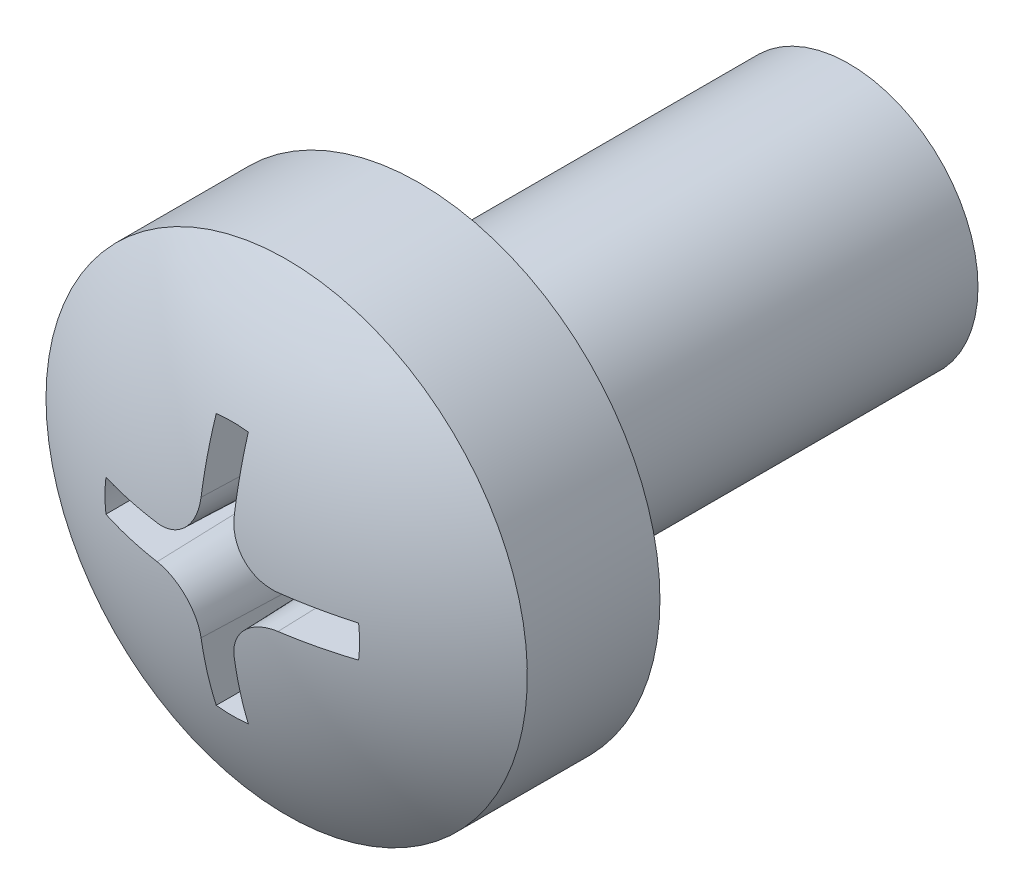
ISO-10303-21;
HEADER;
FILE_DESCRIPTION(('STEP AP214'),'2;1');
FILE_NAME('part.step','',(''),(''),'','','');
FILE_SCHEMA(('AUTOMOTIVE_DESIGN { 1 0 10303 214 1 1 1 1 }'));
ENDSEC;
DATA;
#1=APPLICATION_CONTEXT('core data for automotive mechanical design processes');
#2=APPLICATION_PROTOCOL_DEFINITION('international standard','automotive_design',2000,#1);
#3=PRODUCT_CONTEXT('',#1,'mechanical');
#4=PRODUCT('Part','Part','',(#3));
#5=PRODUCT_RELATED_PRODUCT_CATEGORY('part','',(#4));
#6=PRODUCT_DEFINITION_FORMATION('','',#4);
#7=PRODUCT_DEFINITION_CONTEXT('part definition',#1,'design');
#8=PRODUCT_DEFINITION('design','',#6,#7);
#9=PRODUCT_DEFINITION_SHAPE('','',#8);
#10=(LENGTH_UNIT() NAMED_UNIT(*) SI_UNIT(.MILLI.,.METRE.));
#11=(NAMED_UNIT(*) PLANE_ANGLE_UNIT() SI_UNIT($,.RADIAN.));
#12=(NAMED_UNIT(*) SI_UNIT($,.STERADIAN.) SOLID_ANGLE_UNIT());
#13=UNCERTAINTY_MEASURE_WITH_UNIT(LENGTH_MEASURE(1.E-05),#10,'distance_accuracy_value','');
#14=(GEOMETRIC_REPRESENTATION_CONTEXT(3) GLOBAL_UNCERTAINTY_ASSIGNED_CONTEXT((#13)) GLOBAL_UNIT_ASSIGNED_CONTEXT((#10,
#11,#12)) REPRESENTATION_CONTEXT('',''));
#15=CARTESIAN_POINT('',(0.,0.,0.));
#16=DIRECTION('',(0.,0.,1.));
#17=DIRECTION('',(1.,0.,0.));
#18=AXIS2_PLACEMENT_3D('',#15,#16,#17);
#19=CARTESIAN_POINT('',(0.,0.,5.));
#20=DIRECTION('',(0.,0.,-1.));
#21=DIRECTION('',(-1.,0.,0.));
#22=AXIS2_PLACEMENT_3D('',#19,#20,#21);
#23=CYLINDRICAL_SURFACE('',#22,1.5);
#24=CARTESIAN_POINT('',(0.,0.,5.));
#25=DIRECTION('',(0.,0.,1.));
#26=DIRECTION('',(1.,0.,0.));
#27=AXIS2_PLACEMENT_3D('',#24,#25,#26);
#28=CIRCLE('',#27,1.5);
#29=CARTESIAN_POINT('',(1.5,0.,5.));
#30=VERTEX_POINT('',#29);
#31=EDGE_CURVE('E213',#30,#30,#28,.T.);
#32=ORIENTED_EDGE('',*,*,#31,.F.);
#33=EDGE_LOOP('',(#32));
#34=FACE_BOUND('',#33,.T.);
#35=CARTESIAN_POINT('',(0.,0.,-0.0001));
#36=DIRECTION('',(0.,0.,1.));
#37=DIRECTION('',(1.,0.,0.));
#38=AXIS2_PLACEMENT_3D('',#35,#36,#37);
#39=CIRCLE('',#38,1.5);
#40=CARTESIAN_POINT('',(1.5,0.,-0.0001));
#41=VERTEX_POINT('',#40);
#42=EDGE_CURVE('E210',#41,#41,#39,.T.);
#43=ORIENTED_EDGE('',*,*,#42,.T.);
#44=EDGE_LOOP('',(#43));
#45=FACE_BOUND('',#44,.T.);
#46=ADVANCED_FACE('F39',(#34,#45),#23,.T.);
#47=CARTESIAN_POINT('',(0.,0.,-0.0001));
#48=DIRECTION('',(0.,0.,1.));
#49=DIRECTION('',(1.,0.,0.));
#50=AXIS2_PLACEMENT_3D('',#47,#48,#49);
#51=PLANE('',#50);
#52=ORIENTED_EDGE('',*,*,#42,.F.);
#53=EDGE_LOOP('',(#52));
#54=FACE_BOUND('',#53,.T.);
#55=ADVANCED_FACE('F300',(#54),#51,.F.);
#56=CARTESIAN_POINT('',(0.,0.,5.));
#57=DIRECTION('',(0.,0.,-1.));
#58=DIRECTION('',(-1.,0.,0.));
#59=AXIS2_PLACEMENT_3D('',#56,#57,#58);
#60=PLANE('',#59);
#61=ORIENTED_EDGE('',*,*,#31,.T.);
#62=EDGE_LOOP('',(#61));
#63=FACE_BOUND('',#62,.T.);
#64=CARTESIAN_POINT('',(0.,0.,5.));
#65=DIRECTION('',(0.,0.,-1.));
#66=DIRECTION('',(-1.,0.,0.));
#67=AXIS2_PLACEMENT_3D('',#64,#65,#66);
#68=CIRCLE('',#67,2.79999990016222);
#69=CARTESIAN_POINT('',(-2.79999990016222,0.,5.));
#70=VERTEX_POINT('',#69);
#71=EDGE_CURVE('E207',#70,#70,#68,.T.);
#72=ORIENTED_EDGE('',*,*,#71,.T.);
#73=EDGE_LOOP('',(#72));
#74=FACE_BOUND('',#73,.T.);
#75=ADVANCED_FACE('F305',(#63,#74),#60,.T.);
#76=CARTESIAN_POINT('',(0.,0.,-0.393620134621003));
#77=DIRECTION('',(0.,0.,-1.));
#78=DIRECTION('',(-1.,0.,0.));
#79=AXIS2_PLACEMENT_3D('',#76,#77,#78);
#80=CYLINDRICAL_SURFACE('',#79,2.79999990016222);
#81=CARTESIAN_POINT('',(0.,0.,6.54246307978926));
#82=DIRECTION('',(0.,0.,-1.));
#83=DIRECTION('',(-1.,0.,0.));
#84=AXIS2_PLACEMENT_3D('',#81,#82,#83);
#85=CIRCLE('',#84,2.79999990016222);
#86=CARTESIAN_POINT('',(-2.79999990016222,0.,6.54246307978926));
#87=VERTEX_POINT('',#86);
#88=EDGE_CURVE('E155',#87,#87,#85,.T.);
#89=ORIENTED_EDGE('',*,*,#88,.T.);
#90=EDGE_LOOP('',(#89));
#91=FACE_BOUND('',#90,.T.);
#92=ORIENTED_EDGE('',*,*,#71,.F.);
#93=EDGE_LOOP('',(#92));
#94=FACE_BOUND('',#93,.T.);
#95=ADVANCED_FACE('F313',(#91,#94),#80,.T.);
#96=CARTESIAN_POINT('',(0.,0.,2.40000011175871));
#97=DIRECTION('',(0.,0.,-1.));
#98=DIRECTION('',(1.,0.,0.));
#99=AXIS2_PLACEMENT_3D('',#96,#97,#98);
#100=SPHERICAL_SURFACE('',#99,4.99999988824129);
#101=CARTESIAN_POINT('',(0.,0.,7.17541838215017));
#102=DIRECTION('',(0.,0.,-1.));
#103=DIRECTION('',(-1.,0.,0.));
#104=AXIS2_PLACEMENT_3D('',#101,#102,#103);
#105=CIRCLE('',#104,1.4816812157899);
#106=CARTESIAN_POINT('',(0.18668120666759,1.46987392394782,7.17541838215014));
#107=VERTEX_POINT('',#106);
#108=CARTESIAN_POINT('',(-0.186681206667593,1.46987392394782,7.17541838215014));
#109=VERTEX_POINT('',#108);
#110=EDGE_CURVE('E11',#107,#109,#105,.F.);
#111=ORIENTED_EDGE('',*,*,#110,.F.);
#112=CARTESIAN_POINT('',(0.0198956640512633,0.,2.39930533986049));
#113=DIRECTION('',(0.999390827019096,0.,-0.034899496702501));
#114=DIRECTION('',(-0.034899496702501,0.,-0.999390827019096));
#115=AXIS2_PLACEMENT_3D('',#112,#113,#114);
#116=CIRCLE('',#115,4.99996025606773);
#117=CARTESIAN_POINT('',(0.192632610704328,0.708178557647151,7.34584429553512));
#118=VERTEX_POINT('',#117);
#119=EDGE_CURVE('E46',#107,#118,#116,.T.);
#120=ORIENTED_EDGE('',*,*,#119,.T.);
#121=CARTESIAN_POINT('',(0.192631650862954,0.708378557647151,7.34581569147501));
#122=CARTESIAN_POINT('',(0.192737639690806,0.679822741796073,7.34990414397343));
#123=CARTESIAN_POINT('',(0.195268867839181,0.651227392830895,7.35364633624145));
#124=CARTESIAN_POINT('',(0.205046889209158,0.594767038274589,7.36034605517117));
#125=CARTESIAN_POINT('',(0.212292618678018,0.566901869404939,7.36330375862852));
#126=CARTESIAN_POINT('',(0.231373694375068,0.51267267841366,7.36834660632538));
#127=CARTESIAN_POINT('',(0.24321326807329,0.486310064716558,7.37043094316672));
#128=CARTESIAN_POINT('',(0.271156607880554,0.435900324544808,7.37366034910124));
#129=CARTESIAN_POINT('',(0.287258672100205,0.411852279143785,7.37480579232145));
#130=CARTESIAN_POINT('',(0.323072075489886,0.367028886470805,7.37611580257173));
#131=CARTESIAN_POINT('',(0.342740648168188,0.346219679514825,7.37629128935958));
#132=CARTESIAN_POINT('',(0.385246757538768,0.308146709447779,7.37568534569509));
#133=CARTESIAN_POINT('',(0.408084792807392,0.290883505206881,7.37490376453834));
#134=CARTESIAN_POINT('',(0.456147210008962,0.260464262414973,7.37241339517053));
#135=CARTESIAN_POINT('',(0.481359759209806,0.247289131136678,7.37070902247329));
#136=CARTESIAN_POINT('',(0.533541444049374,0.225283958921734,7.3664258870809));
#137=CARTESIAN_POINT('',(0.560509920861878,0.216452298826715,7.36384745082543));
#138=CARTESIAN_POINT('',(0.606876295057339,0.205379627868596,7.35882076515576));
#139=CARTESIAN_POINT('',(0.626020977094075,0.201943221890058,7.35658129607485));
#140=CARTESIAN_POINT('',(0.664502044043211,0.197253494550335,7.3517582366185));
#141=CARTESIAN_POINT('',(0.683838077649067,0.195996727127303,7.34917519641301));
#142=CARTESIAN_POINT('',(0.703167546290468,0.195835015722445,7.34643346629547));
#143=B_SPLINE_CURVE_WITH_KNOTS('',3,(#121,#122,#123,#124,#125,#126,#127,#128,#129,#130,#131,
#132,#133,#134,#135,#136,#137,#138,#139,#140,#141,#142),.UNSPECIFIED.,.F.,.F.,(4,2,2,2,2,2,2,2,
2,2,4),(0.,0.0864417829586748,0.172864068455127,0.259366073122685,0.345833591994609,
0.43132564691208,0.516831165542017,0.601931114274005,0.686999315371811,0.745618262708562,
0.804144447281415),.UNSPECIFIED.);
#144=CARTESIAN_POINT('',(0.702917362553185,0.19583721033533,7.3464689381926));
#145=VERTEX_POINT('',#144);
#146=EDGE_CURVE('E282',#118,#145,#143,.T.);
#147=ORIENTED_EDGE('',*,*,#146,.T.);
#148=CARTESIAN_POINT('',(0.00010539015335045,0.0259265633149155,2.39909472873738));
#149=DIRECTION('',(0.00406243901494415,0.999382570249833,-0.034899496702501));
#150=DIRECTION('',(0.,0.0348997846864301,0.999390816962434));
#151=AXIS2_PLACEMENT_3D('',#148,#149,#150);
#152=CIRCLE('',#151,4.99993258603575);
#153=CARTESIAN_POINT('',(1.46986565043204,0.186746338396853,7.17541838215017));
#154=VERTEX_POINT('',#153);
#155=EDGE_CURVE('E280',#154,#145,#152,.F.);
#156=ORIENTED_EDGE('',*,*,#155,.F.);
#157=CARTESIAN_POINT('',(0.,0.,7.17541838215017));
#158=DIRECTION('',(0.,0.,-1.));
#159=DIRECTION('',(-1.,0.,0.));
#160=AXIS2_PLACEMENT_3D('',#157,#158,#159);
#161=CIRCLE('',#160,1.4816812157899);
#162=CARTESIAN_POINT('',(1.46986565043204,-0.186746338396852,7.17541838215014));
#163=VERTEX_POINT('',#162);
#164=EDGE_CURVE('E278',#163,#154,#161,.F.);
#165=ORIENTED_EDGE('',*,*,#164,.F.);
#166=CARTESIAN_POINT('',(0.000105390153350481,-0.0259265633149169,2.39909472873738));
#167=DIRECTION('',(0.00406243901494512,-0.999382570249833,-0.034899496702501));
#168=DIRECTION('',(0.,0.0348997846864301,-0.999390816962434));
#169=AXIS2_PLACEMENT_3D('',#166,#167,#168);
#170=CIRCLE('',#169,4.99993258603575);
#171=CARTESIAN_POINT('',(0.702917362553185,-0.195837210335331,7.3464689381926));
#172=VERTEX_POINT('',#171);
#173=EDGE_CURVE('E275',#163,#172,#170,.T.);
#174=ORIENTED_EDGE('',*,*,#173,.T.);
#175=CARTESIAN_POINT('',(0.192631650862954,-0.708378557647152,7.34581569147501));
#176=CARTESIAN_POINT('',(0.192737639690806,-0.679822741796074,7.34990414397343));
#177=CARTESIAN_POINT('',(0.195268867839181,-0.651227392830896,7.35364633624145));
#178=CARTESIAN_POINT('',(0.205046889209158,-0.59476703827459,7.36034605517117));
#179=CARTESIAN_POINT('',(0.212292618678018,-0.566901869404939,7.36330375862852));
#180=CARTESIAN_POINT('',(0.231373694375068,-0.51267267841366,7.36834660632538));
#181=CARTESIAN_POINT('',(0.24321326807329,-0.486310064716559,7.37043094316673));
#182=CARTESIAN_POINT('',(0.271156607880554,-0.435900324544809,7.37366034910124));
#183=CARTESIAN_POINT('',(0.287258672100205,-0.411852279143786,7.37480579232145));
#184=CARTESIAN_POINT('',(0.323072075489886,-0.367028886470806,7.37611580257173));
#185=CARTESIAN_POINT('',(0.342740648168188,-0.346219679514826,7.37629128935958));
#186=CARTESIAN_POINT('',(0.385246757538768,-0.30814670944778,7.37568534569509));
#187=CARTESIAN_POINT('',(0.408084792807393,-0.290883505206882,7.37490376453834));
#188=CARTESIAN_POINT('',(0.456147210008962,-0.260464262414974,7.37241339517053));
#189=CARTESIAN_POINT('',(0.481359759209806,-0.247289131136679,7.37070902247329));
#190=CARTESIAN_POINT('',(0.533541444049375,-0.225283958921735,7.3664258870809));
#191=CARTESIAN_POINT('',(0.560509920861878,-0.216452298826716,7.36384745082543));
#192=CARTESIAN_POINT('',(0.606876295057339,-0.205379627868597,7.35882076515576));
#193=CARTESIAN_POINT('',(0.626020977094075,-0.201943221890059,7.35658129607485));
#194=CARTESIAN_POINT('',(0.664502044043211,-0.197253494550336,7.3517582366185));
#195=CARTESIAN_POINT('',(0.683838077649067,-0.195996727127304,7.34917519641301));
#196=CARTESIAN_POINT('',(0.703167546290467,-0.195835015722445,7.34643346629547));
#197=B_SPLINE_CURVE_WITH_KNOTS('',3,(#175,#176,#177,#178,#179,#180,#181,#182,#183,#184,#185,
#186,#187,#188,#189,#190,#191,#192,#193,#194,#195,#196),.UNSPECIFIED.,.F.,.F.,(4,2,2,2,2,2,2,2,
2,2,4),(0.,0.086441782958675,0.172864068455127,0.259366073122685,0.345833591994609,
0.43132564691208,0.516831165542017,0.601931114274005,0.686999315371811,0.745618262708562,
0.804144447281415),.UNSPECIFIED.);
#198=CARTESIAN_POINT('',(0.192632610704328,-0.708178557647152,7.34584429553512));
#199=VERTEX_POINT('',#198);
#200=EDGE_CURVE('E269',#199,#172,#197,.T.);
#201=ORIENTED_EDGE('',*,*,#200,.F.);
#202=CARTESIAN_POINT('',(0.0198956640512633,0.,2.39930533986049));
#203=DIRECTION('',(0.999390827019096,0.,-0.034899496702501));
#204=DIRECTION('',(-0.034899496702501,0.,-0.999390827019096));
#205=AXIS2_PLACEMENT_3D('',#202,#203,#204);
#206=CIRCLE('',#205,4.99996025606773);
#207=CARTESIAN_POINT('',(0.186681206667591,-1.46987392394782,7.17541838215017));
#208=VERTEX_POINT('',#207);
#209=EDGE_CURVE('E267',#208,#199,#206,.F.);
#210=ORIENTED_EDGE('',*,*,#209,.F.);
#211=CARTESIAN_POINT('',(0.,0.,7.17541838215017));
#212=DIRECTION('',(0.,0.,-1.));
#213=DIRECTION('',(-1.,0.,0.));
#214=AXIS2_PLACEMENT_3D('',#211,#212,#213);
#215=CIRCLE('',#214,1.4816812157899);
#216=CARTESIAN_POINT('',(-0.186681206667593,-1.46987392394782,7.17541838215014));
#217=VERTEX_POINT('',#216);
#218=EDGE_CURVE('E264',#208,#217,#215,.T.);
#219=ORIENTED_EDGE('',*,*,#218,.T.);
#220=CARTESIAN_POINT('',(-0.0198956640512654,0.,2.39930533986049));
#221=DIRECTION('',(-0.999390827019096,0.,-0.034899496702501));
#222=DIRECTION('',(-0.034899496702501,0.,0.999390827019096));
#223=AXIS2_PLACEMENT_3D('',#220,#221,#222);
#224=CIRCLE('',#223,4.99996025606773);
#225=CARTESIAN_POINT('',(-0.19263261070433,-0.708178557647151,7.34584429553512));
#226=VERTEX_POINT('',#225);
#227=EDGE_CURVE('E260',#217,#226,#224,.T.);
#228=ORIENTED_EDGE('',*,*,#227,.T.);
#229=CARTESIAN_POINT('',(-0.703167546290469,-0.195835015722445,7.34643346629547));
#230=CARTESIAN_POINT('',(-0.674619447950853,-0.196052963217916,7.35048572416475));
#231=CARTESIAN_POINT('',(-0.646041434637229,-0.198695168407334,7.35418904161906));
#232=CARTESIAN_POINT('',(-0.589634494727846,-0.208689654905481,7.36080680147558));
#233=CARTESIAN_POINT('',(-0.561805393198952,-0.216040826152063,7.36372142956822));
#234=CARTESIAN_POINT('',(-0.50766612082123,-0.235323893103952,7.36867508610456));
#235=CARTESIAN_POINT('',(-0.481357369172764,-0.247259991703852,7.37071330752301));
#236=CARTESIAN_POINT('',(-0.431071022991569,-0.275383990623327,7.37384890996341));
#237=CARTESIAN_POINT('',(-0.407092510169895,-0.291570206692358,7.37494666294437));
#238=CARTESIAN_POINT('',(-0.362416703115867,-0.327538701485094,7.37616180832018));
#239=CARTESIAN_POINT('',(-0.34168588735275,-0.347278991317759,7.37628996638402));
#240=CARTESIAN_POINT('',(-0.303780328011577,-0.389912448398922,7.37559036471605));
#241=CARTESIAN_POINT('',(-0.286606147147997,-0.412806113607388,7.37476245385545));
#242=CARTESIAN_POINT('',(-0.25636685808405,-0.460969475916929,7.37218162580557));
#243=CARTESIAN_POINT('',(-0.243283863198687,-0.486228184526672,7.37043282748058));
#244=CARTESIAN_POINT('',(-0.22146899790456,-0.538485231439468,7.36606389829698));
#245=CARTESIAN_POINT('',(-0.212735526227358,-0.565482925398505,7.36344408869266));
#246=CARTESIAN_POINT('',(-0.201823996880683,-0.61191361527353,7.35834781298739));
#247=CARTESIAN_POINT('',(-0.198453223120025,-0.631098599357625,7.3560784464194));
#248=CARTESIAN_POINT('',(-0.193901764340931,-0.669652448873598,7.35119687303864));
#249=CARTESIAN_POINT('',(-0.192717622166764,-0.689020975292663,7.34858521441869));
#250=CARTESIAN_POINT('',(-0.192631650862956,-0.708378557647151,7.34581569147501));
#251=B_SPLINE_CURVE_WITH_KNOTS('',3,(#229,#230,#231,#232,#233,#234,#235,#236,#237,#238,#239,
#240,#241,#242,#243,#244,#245,#246,#247,#248,#249,#250),.UNSPECIFIED.,.F.,.F.,(4,2,2,2,2,2,2,2,
2,2,4),(0.,0.0864053436114192,0.172790326060609,0.259254685287909,0.34568483171133,
0.431153892876567,0.51663646625136,0.601739908197796,0.686811996276178,0.745524819849982,
0.804144736260156),.UNSPECIFIED.);
#252=CARTESIAN_POINT('',(-0.702917362553187,-0.195837210335331,7.3464689381926));
#253=VERTEX_POINT('',#252);
#254=EDGE_CURVE('E253',#253,#226,#251,.T.);
#255=ORIENTED_EDGE('',*,*,#254,.F.);
#256=CARTESIAN_POINT('',(-0.000105390153349556,-0.0259265633149168,2.39909472873738));
#257=DIRECTION('',(-0.0040624390149453,-0.999382570249833,-0.034899496702501));
#258=DIRECTION('',(0.,0.0348997846864301,-0.999390816962434));
#259=AXIS2_PLACEMENT_3D('',#256,#257,#258);
#260=CIRCLE('',#259,4.99993258603575);
#261=CARTESIAN_POINT('',(-1.46986565043204,-0.186746338396853,7.17541838215018));
#262=VERTEX_POINT('',#261);
#263=EDGE_CURVE('E261',#262,#253,#260,.F.);
#264=ORIENTED_EDGE('',*,*,#263,.F.);
#265=CARTESIAN_POINT('',(0.,0.,7.17541838215018));
#266=DIRECTION('',(0.,0.,-1.));
#267=DIRECTION('',(-1.,0.,0.));
#268=AXIS2_PLACEMENT_3D('',#265,#266,#267);
#269=CIRCLE('',#268,1.4816812157899);
#270=CARTESIAN_POINT('',(-1.46986565043204,0.186746338396852,7.17541838215014));
#271=VERTEX_POINT('',#270);
#272=EDGE_CURVE('E521',#262,#271,#269,.T.);
#273=ORIENTED_EDGE('',*,*,#272,.T.);
#274=CARTESIAN_POINT('',(-0.000105390153349556,0.0259265633149168,2.39909472873738));
#275=DIRECTION('',(-0.00406243901494529,0.999382570249833,-0.034899496702501));
#276=DIRECTION('',(0.,0.0348997846864301,0.999390816962434));
#277=AXIS2_PLACEMENT_3D('',#274,#275,#276);
#278=CIRCLE('',#277,4.99993258603575);
#279=CARTESIAN_POINT('',(-0.702917362553187,0.195837210335331,7.3464689381926));
#280=VERTEX_POINT('',#279);
#281=EDGE_CURVE('E226',#271,#280,#278,.T.);
#282=ORIENTED_EDGE('',*,*,#281,.T.);
#283=CARTESIAN_POINT('',(-0.192631650862955,0.708378557647151,7.34581569147501));
#284=CARTESIAN_POINT('',(-0.192737639690808,0.679822741796074,7.34990414397343));
#285=CARTESIAN_POINT('',(-0.195268867839183,0.651227392830896,7.35364633624145));
#286=CARTESIAN_POINT('',(-0.20504688920916,0.59476703827459,7.36034605517117));
#287=CARTESIAN_POINT('',(-0.21229261867802,0.566901869404939,7.36330375862852));
#288=CARTESIAN_POINT('',(-0.23137369437507,0.51267267841366,7.36834660632538));
#289=CARTESIAN_POINT('',(-0.243213268073292,0.486310064716558,7.37043094316673));
#290=CARTESIAN_POINT('',(-0.271156607880556,0.435900324544809,7.37366034910124));
#291=CARTESIAN_POINT('',(-0.287258672100207,0.411852279143786,7.37480579232145));
#292=CARTESIAN_POINT('',(-0.323072075489888,0.367028886470806,7.37611580257173));
#293=CARTESIAN_POINT('',(-0.34274064816819,0.346219679514825,7.37629128935958));
#294=CARTESIAN_POINT('',(-0.38524675753877,0.30814670944778,7.37568534569509));
#295=CARTESIAN_POINT('',(-0.408084792807394,0.290883505206881,7.37490376453834));
#296=CARTESIAN_POINT('',(-0.456147210008964,0.260464262414973,7.37241339517053));
#297=CARTESIAN_POINT('',(-0.481359759209807,0.247289131136679,7.37070902247329));
#298=CARTESIAN_POINT('',(-0.533541444049376,0.225283958921734,7.3664258870809));
#299=CARTESIAN_POINT('',(-0.56050992086188,0.216452298826716,7.36384745082543));
#300=CARTESIAN_POINT('',(-0.606876295057341,0.205379627868597,7.35882076515576));
#301=CARTESIAN_POINT('',(-0.626020977094076,0.201943221890059,7.35658129607485));
#302=CARTESIAN_POINT('',(-0.664502044043212,0.197253494550336,7.3517582366185));
#303=CARTESIAN_POINT('',(-0.683838077649069,0.195996727127304,7.34917519641301));
#304=CARTESIAN_POINT('',(-0.703167546290469,0.195835015722445,7.34643346629547));
#305=B_SPLINE_CURVE_WITH_KNOTS('',3,(#283,#284,#285,#286,#287,#288,#289,#290,#291,#292,#293,
#294,#295,#296,#297,#298,#299,#300,#301,#302,#303,#304),.UNSPECIFIED.,.F.,.F.,(4,2,2,2,2,2,2,2,
2,2,4),(0.,0.0864417829586746,0.172864068455127,0.259366073122685,0.345833591994609,
0.431325646912079,0.516831165542017,0.601931114274005,0.686999315371811,0.745618262708562,
0.804144447281414),.UNSPECIFIED.);
#306=CARTESIAN_POINT('',(-0.19263261070433,0.708178557647151,7.34584429553512));
#307=VERTEX_POINT('',#306);
#308=EDGE_CURVE('E218',#307,#280,#305,.T.);
#309=ORIENTED_EDGE('',*,*,#308,.F.);
#310=CARTESIAN_POINT('',(-0.0198956640512644,0.,2.39930533986049));
#311=DIRECTION('',(-0.999390827019096,0.,-0.034899496702501));
#312=DIRECTION('',(-0.034899496702501,0.,0.999390827019096));
#313=AXIS2_PLACEMENT_3D('',#310,#311,#312);
#314=CIRCLE('',#313,4.99996025606773);
#315=EDGE_CURVE('E216',#109,#307,#314,.F.);
#316=ORIENTED_EDGE('',*,*,#315,.F.);
#317=EDGE_LOOP('',(#111,#120,#147,#156,#165,#174,#201,#210,#219,#228,#255,#264,#273,#282,#309,#316));
#318=FACE_BOUND('',#317,.T.);
#319=ORIENTED_EDGE('',*,*,#88,.F.);
#320=EDGE_LOOP('',(#319));
#321=FACE_BOUND('',#320,.T.);
#322=ADVANCED_FACE('F228',(#318,#321),#100,.T.);
#323=CARTESIAN_POINT('',(0.,0.,7.7000001));
#324=DIRECTION('',(0.,0.,1.));
#325=DIRECTION('',(1.,0.,0.));
#326=AXIS2_PLACEMENT_3D('',#323,#324,#325);
#327=CONICAL_SURFACE('',#326,1.50000001303852,0.0349065850398867);
#328=ORIENTED_EDGE('',*,*,#110,.T.);
#329=CARTESIAN_POINT('',(-0.142142619910814,1.43009594495933,5.90000013091991));
#330=CARTESIAN_POINT('',(-0.152618658076336,1.43957885994155,6.19999461322929));
#331=CARTESIAN_POINT('',(-0.163094792502732,1.4489727928664,6.49999185208944));
#332=CARTESIAN_POINT('',(-0.184047253837866,1.46758269456637,7.09999184178283));
#333=CARTESIAN_POINT('',(-0.194523580746602,1.47679866334215,7.39999459261603));
#334=CARTESIAN_POINT('',(-0.205000003916213,1.48592565006124,7.7000001));
#335=B_SPLINE_CURVE_WITH_KNOTS('',3,(#329,#330,#331,#332,#333,#334),.UNSPECIFIED.,.F.,.F.,(4,2,
4),(0.,0.900981158642232,1.80196231389533),.UNSPECIFIED.);
#336=CARTESIAN_POINT('',(-0.142142619910814,1.43009594495933,5.90000013091991));
#337=VERTEX_POINT('',#336);
#338=EDGE_CURVE('E53',#337,#109,#335,.T.);
#339=ORIENTED_EDGE('',*,*,#338,.F.);
#340=CARTESIAN_POINT('',(0.,0.,5.90000013091991));
#341=DIRECTION('',(0.,0.,1.));
#342=DIRECTION('',(1.,0.,0.));
#343=AXIS2_PLACEMENT_3D('',#340,#341,#342);
#344=CIRCLE('',#343,1.43714262903312);
#345=CARTESIAN_POINT('',(0.142142619910811,1.43009594495933,5.90000013091991));
#346=VERTEX_POINT('',#345);
#347=EDGE_CURVE('E163',#346,#337,#344,.T.);
#348=ORIENTED_EDGE('',*,*,#347,.F.);
#349=CARTESIAN_POINT('',(0.142142619910811,1.43009594495933,5.90000013091991));
#350=CARTESIAN_POINT('',(0.152618658076333,1.43957885994155,6.19999461322929));
#351=CARTESIAN_POINT('',(0.16309479250273,1.4489727928664,6.49999185208944));
#352=CARTESIAN_POINT('',(0.184047253837863,1.46758269456637,7.09999184178283));
#353=CARTESIAN_POINT('',(0.1945235807466,1.47679866334215,7.39999459261603));
#354=CARTESIAN_POINT('',(0.205000003916211,1.48592565006124,7.7000001));
#355=B_SPLINE_CURVE_WITH_KNOTS('',3,(#349,#350,#351,#352,#353,#354),.UNSPECIFIED.,.F.,.F.,(4,2,
4),(0.,0.900981158642232,1.80196231389533),.UNSPECIFIED.);
#356=EDGE_CURVE('E147',#346,#107,#355,.T.);
#357=ORIENTED_EDGE('',*,*,#356,.T.);
#358=EDGE_LOOP('',(#328,#339,#348,#357));
#359=FACE_BOUND('',#358,.T.);
#360=ADVANCED_FACE('F167',(#359),#327,.F.);
#361=CARTESIAN_POINT('',(0.205000003916211,1.48592565006124,7.7000001));
#362=DIRECTION('',(0.999390827019096,0.,-0.034899496702501));
#363=DIRECTION('',(-0.034899496702501,0.,-0.999390827019096));
#364=AXIS2_PLACEMENT_3D('',#361,#362,#363);
#365=PLANE('',#364);
#366=ORIENTED_EDGE('',*,*,#356,.F.);
#367=DIRECTION('',(0.,1.,0.));
#368=VECTOR('',#367,1.);
#369=CARTESIAN_POINT('',(0.142142619910812,0.,5.90000013091991));
#370=LINE('',#369,#368);
#371=CARTESIAN_POINT('',(0.142142619910811,0.708178557647151,5.90000013091991));
#372=VERTEX_POINT('',#371);
#373=EDGE_CURVE('E150',#346,#372,#370,.F.);
#374=ORIENTED_EDGE('',*,*,#373,.T.);
#375=DIRECTION('',(0.034899496702501,0.,0.999390827019096));
#376=VECTOR('',#375,1.);
#377=CARTESIAN_POINT('',(0.20500000391621,0.708178557647151,7.7000001));
#378=LINE('',#377,#376);
#379=EDGE_CURVE('E156',#372,#118,#378,.T.);
#380=ORIENTED_EDGE('',*,*,#379,.T.);
#381=ORIENTED_EDGE('',*,*,#119,.F.);
#382=EDGE_LOOP('',(#366,#374,#380,#381));
#383=FACE_BOUND('',#382,.T.);
#384=ADVANCED_FACE('F149',(#383),#365,.F.);
#385=CARTESIAN_POINT('',(0.705000003916211,0.708178557647151,7.7000001));
#386=DIRECTION('',(0.,0.,-1.));
#387=DIRECTION('',(1.,0.,0.));
#388=AXIS2_PLACEMENT_3D('',#385,#386,#387);
#389=CONICAL_SURFACE('',#388,0.5,0.0349065850398867);
#390=ORIENTED_EDGE('',*,*,#379,.F.);
#391=CARTESIAN_POINT('',(0.705000003916211,0.708178557647151,5.90000013091991));
#392=DIRECTION('',(0.,0.,1.));
#393=DIRECTION('',(1.,0.,0.));
#394=AXIS2_PLACEMENT_3D('',#391,#392,#393);
#395=CIRCLE('',#394,0.562857384005399);
#396=CARTESIAN_POINT('',(0.702712036351556,0.145325823858085,5.90000013091991));
#397=VERTEX_POINT('',#396);
#398=EDGE_CURVE('E165',#372,#397,#395,.T.);
#399=ORIENTED_EDGE('',*,*,#398,.T.);
#400=DIRECTION('',(0.000141863496415148,0.0348992083697649,0.999390827019096));
#401=VECTOR('',#400,1.);
#402=CARTESIAN_POINT('',(0.702967546290468,0.208182688548215,7.7000001));
#403=LINE('',#402,#401);
#404=EDGE_CURVE('E423',#397,#145,#403,.T.);
#405=ORIENTED_EDGE('',*,*,#404,.T.);
#406=ORIENTED_EDGE('',*,*,#146,.F.);
#407=EDGE_LOOP('',(#390,#399,#405,#406));
#408=FACE_BOUND('',#407,.T.);
#409=ADVANCED_FACE('F288',(#408),#389,.T.);
#410=CARTESIAN_POINT('',(1.48592565006123,0.205000003916213,7.7000001));
#411=DIRECTION('',(0.00406243901494415,0.999382570249833,-0.034899496702501));
#412=DIRECTION('',(0.,0.0348997846864301,0.999390816962434));
#413=AXIS2_PLACEMENT_3D('',#410,#411,#412);
#414=PLANE('',#413);
#415=ORIENTED_EDGE('',*,*,#155,.T.);
#416=ORIENTED_EDGE('',*,*,#404,.F.);
#417=DIRECTION('',(-0.99999173819787,0.00406491525148502,0.));
#418=VECTOR('',#417,1.);
#419=CARTESIAN_POINT('',(0.000602343564913371,0.148179863836023,5.90000013091991));
#420=LINE('',#419,#418);
#421=CARTESIAN_POINT('',(1.43007341244828,0.142369137079488,5.90000013091991));
#422=VERTEX_POINT('',#421);
#423=EDGE_CURVE('E176',#422,#397,#420,.T.);
#424=ORIENTED_EDGE('',*,*,#423,.F.);
#425=CARTESIAN_POINT('',(1.43007341244828,0.142369137079488,5.90000013091991));
#426=CARTESIAN_POINT('',(1.43955869120937,0.152806706922151,6.19999467904414));
#427=CARTESIAN_POINT('',(1.44895568373278,0.163244730756208,6.49999195080733));
#428=CARTESIAN_POINT('',(1.46757309626977,0.184121686368453,7.09999194050071));
#429=CARTESIAN_POINT('',(1.47679351628402,0.194560618146638,7.39999465843089));
#430=CARTESIAN_POINT('',(1.48592565006123,0.205000003916213,7.7000001));
#431=B_SPLINE_CURVE_WITH_KNOTS('',3,(#425,#426,#427,#428,#429,#430),.UNSPECIFIED.,.F.,.F.,(4,2,
4),(0.,0.900977563471275,1.80195512360615),.UNSPECIFIED.);
#432=EDGE_CURVE('E417',#422,#154,#431,.T.);
#433=ORIENTED_EDGE('',*,*,#432,.T.);
#434=EDGE_LOOP('',(#415,#416,#424,#433));
#435=FACE_BOUND('',#434,.T.);
#436=ADVANCED_FACE('F240',(#435),#414,.F.);
#437=CARTESIAN_POINT('',(0.,0.,7.7000001));
#438=DIRECTION('',(0.,0.,1.));
#439=DIRECTION('',(1.,0.,0.));
#440=AXIS2_PLACEMENT_3D('',#437,#438,#439);
#441=CONICAL_SURFACE('',#440,1.50000001303852,0.0349065850398867);
#442=ORIENTED_EDGE('',*,*,#164,.T.);
#443=ORIENTED_EDGE('',*,*,#432,.F.);
#444=CARTESIAN_POINT('',(0.,0.,5.90000013091991));
#445=DIRECTION('',(0.,0.,1.));
#446=DIRECTION('',(1.,0.,0.));
#447=AXIS2_PLACEMENT_3D('',#444,#445,#446);
#448=CIRCLE('',#447,1.43714262903312);
#449=CARTESIAN_POINT('',(1.43007341244828,-0.142369137079488,5.90000013091991));
#450=VERTEX_POINT('',#449);
#451=EDGE_CURVE('E178',#450,#422,#448,.T.);
#452=ORIENTED_EDGE('',*,*,#451,.F.);
#453=CARTESIAN_POINT('',(1.43007341244828,-0.142369137079488,5.90000013091991));
#454=CARTESIAN_POINT('',(1.43955869120937,-0.152806706922151,6.19999467904414));
#455=CARTESIAN_POINT('',(1.44895568373278,-0.163244730756208,6.49999195080733));
#456=CARTESIAN_POINT('',(1.46757309626977,-0.184121686368453,7.09999194050071));
#457=CARTESIAN_POINT('',(1.47679351628402,-0.194560618146638,7.39999465843089));
#458=CARTESIAN_POINT('',(1.48592565006123,-0.205000003916213,7.7000001));
#459=B_SPLINE_CURVE_WITH_KNOTS('',3,(#453,#454,#455,#456,#457,#458),.UNSPECIFIED.,.F.,.F.,(4,2,
4),(0.,0.900977563471275,1.80195512360615),.UNSPECIFIED.);
#460=EDGE_CURVE('E411',#450,#163,#459,.T.);
#461=ORIENTED_EDGE('',*,*,#460,.T.);
#462=EDGE_LOOP('',(#442,#443,#452,#461));
#463=FACE_BOUND('',#462,.T.);
#464=ADVANCED_FACE('F296',(#463),#441,.F.);
#465=CARTESIAN_POINT('',(1.48592565006123,-0.205000003916213,7.7000001));
#466=DIRECTION('',(0.00406243901494512,-0.999382570249833,-0.034899496702501));
#467=DIRECTION('',(0.,0.0348997846864301,-0.999390816962434));
#468=AXIS2_PLACEMENT_3D('',#465,#466,#467);
#469=PLANE('',#468);
#470=ORIENTED_EDGE('',*,*,#460,.F.);
#471=DIRECTION('',(0.99999173819787,0.00406491525148599,0.));
#472=VECTOR('',#471,1.);
#473=CARTESIAN_POINT('',(0.00060234356491352,-0.148179863836024,5.90000013091991));
#474=LINE('',#473,#472);
#475=CARTESIAN_POINT('',(0.702712036351556,-0.145325823858086,5.90000013091991));
#476=VERTEX_POINT('',#475);
#477=EDGE_CURVE('E181',#450,#476,#474,.F.);
#478=ORIENTED_EDGE('',*,*,#477,.T.);
#479=DIRECTION('',(0.000141863496415188,-0.0348992083697649,0.999390827019096));
#480=VECTOR('',#479,1.);
#481=CARTESIAN_POINT('',(0.702967546290468,-0.208182688548216,7.7000001));
#482=LINE('',#481,#480);
#483=EDGE_CURVE('E433',#476,#172,#482,.T.);
#484=ORIENTED_EDGE('',*,*,#483,.T.);
#485=ORIENTED_EDGE('',*,*,#173,.F.);
#486=EDGE_LOOP('',(#470,#478,#484,#485));
#487=FACE_BOUND('',#486,.T.);
#488=ADVANCED_FACE('F406',(#487),#469,.F.);
#489=CARTESIAN_POINT('',(0.705000003916211,-0.708178557647152,7.7000001));
#490=DIRECTION('',(0.,0.,-1.));
#491=DIRECTION('',(-1.,0.,0.));
#492=AXIS2_PLACEMENT_3D('',#489,#490,#491);
#493=CONICAL_SURFACE('',#492,0.5,0.0349065850398867);
#494=ORIENTED_EDGE('',*,*,#200,.T.);
#495=ORIENTED_EDGE('',*,*,#483,.F.);
#496=CARTESIAN_POINT('',(0.705000003916211,-0.708178557647152,5.90000013091991));
#497=DIRECTION('',(0.,0.,1.));
#498=DIRECTION('',(1.,0.,0.));
#499=AXIS2_PLACEMENT_3D('',#496,#497,#498);
#500=CIRCLE('',#499,0.562857384005399);
#501=CARTESIAN_POINT('',(0.142142619910812,-0.708178557647152,5.90000013091991));
#502=VERTEX_POINT('',#501);
#503=EDGE_CURVE('E183',#502,#476,#500,.F.);
#504=ORIENTED_EDGE('',*,*,#503,.F.);
#505=DIRECTION('',(0.034899496702501,0.,0.999390827019096));
#506=VECTOR('',#505,1.);
#507=CARTESIAN_POINT('',(0.205000003916211,-0.708178557647152,7.7000001));
#508=LINE('',#507,#506);
#509=EDGE_CURVE('E397',#502,#199,#508,.T.);
#510=ORIENTED_EDGE('',*,*,#509,.T.);
#511=EDGE_LOOP('',(#494,#495,#504,#510));
#512=FACE_BOUND('',#511,.T.);
#513=ADVANCED_FACE('F250',(#512),#493,.T.);
#514=CARTESIAN_POINT('',(0.205000003916211,-1.48592565006124,7.7000001));
#515=DIRECTION('',(0.999390827019096,0.,-0.034899496702501));
#516=DIRECTION('',(-0.034899496702501,0.,-0.999390827019096));
#517=AXIS2_PLACEMENT_3D('',#514,#515,#516);
#518=PLANE('',#517);
#519=ORIENTED_EDGE('',*,*,#209,.T.);
#520=ORIENTED_EDGE('',*,*,#509,.F.);
#521=DIRECTION('',(0.,1.,0.));
#522=VECTOR('',#521,1.);
#523=CARTESIAN_POINT('',(0.142142619910812,0.,5.90000013091991));
#524=LINE('',#523,#522);
#525=CARTESIAN_POINT('',(0.142142619910811,-1.43009594495933,5.90000013091991));
#526=VERTEX_POINT('',#525);
#527=EDGE_CURVE('E186',#526,#502,#524,.T.);
#528=ORIENTED_EDGE('',*,*,#527,.F.);
#529=CARTESIAN_POINT('',(0.142142619910811,-1.43009594495933,5.90000013091991));
#530=CARTESIAN_POINT('',(0.152618658076333,-1.43957885994155,6.19999461322929));
#531=CARTESIAN_POINT('',(0.16309479250273,-1.4489727928664,6.49999185208944));
#532=CARTESIAN_POINT('',(0.184047253837863,-1.46758269456637,7.09999184178283));
#533=CARTESIAN_POINT('',(0.1945235807466,-1.47679866334215,7.39999459261603));
#534=CARTESIAN_POINT('',(0.205000003916211,-1.48592565006124,7.7000001));
#535=B_SPLINE_CURVE_WITH_KNOTS('',3,(#529,#530,#531,#532,#533,#534),.UNSPECIFIED.,.F.,.F.,(4,2,
4),(0.,0.900981158642232,1.80196231389533),.UNSPECIFIED.);
#536=EDGE_CURVE('E389',#526,#208,#535,.T.);
#537=ORIENTED_EDGE('',*,*,#536,.T.);
#538=EDGE_LOOP('',(#519,#520,#528,#537));
#539=FACE_BOUND('',#538,.T.);
#540=ADVANCED_FACE('F399',(#539),#518,.F.);
#541=CARTESIAN_POINT('',(0.,0.,7.7000001));
#542=DIRECTION('',(0.,0.,1.));
#543=DIRECTION('',(-1.,0.,0.));
#544=AXIS2_PLACEMENT_3D('',#541,#542,#543);
#545=CONICAL_SURFACE('',#544,1.50000001303852,0.0349065850398867);
#546=ORIENTED_EDGE('',*,*,#536,.F.);
#547=CARTESIAN_POINT('',(0.,0.,5.90000013091991));
#548=DIRECTION('',(0.,0.,1.));
#549=DIRECTION('',(1.,0.,0.));
#550=AXIS2_PLACEMENT_3D('',#547,#548,#549);
#551=CIRCLE('',#550,1.43714262903312);
#552=CARTESIAN_POINT('',(-0.142142619910814,-1.43009594495933,5.90000013091991));
#553=VERTEX_POINT('',#552);
#554=EDGE_CURVE('E189',#526,#553,#551,.F.);
#555=ORIENTED_EDGE('',*,*,#554,.T.);
#556=CARTESIAN_POINT('',(-0.142142619910814,-1.43009594495933,5.90000013091991));
#557=CARTESIAN_POINT('',(-0.152618658076336,-1.43957885994155,6.19999461322929));
#558=CARTESIAN_POINT('',(-0.163094792502732,-1.4489727928664,6.49999185208944));
#559=CARTESIAN_POINT('',(-0.184047253837866,-1.46758269456637,7.09999184178283));
#560=CARTESIAN_POINT('',(-0.194523580746602,-1.47679866334215,7.39999459261603));
#561=CARTESIAN_POINT('',(-0.205000003916213,-1.48592565006124,7.7000001));
#562=B_SPLINE_CURVE_WITH_KNOTS('',3,(#556,#557,#558,#559,#560,#561),.UNSPECIFIED.,.F.,.F.,(4,2,
4),(0.,0.900981158642232,1.80196231389533),.UNSPECIFIED.);
#563=EDGE_CURVE('E381',#553,#217,#562,.T.);
#564=ORIENTED_EDGE('',*,*,#563,.T.);
#565=ORIENTED_EDGE('',*,*,#218,.F.);
#566=EDGE_LOOP('',(#546,#555,#564,#565));
#567=FACE_BOUND('',#566,.T.);
#568=ADVANCED_FACE('F376',(#567),#545,.F.);
#569=CARTESIAN_POINT('',(-0.205000003916213,-1.48592565006124,7.7000001));
#570=DIRECTION('',(-0.999390827019096,0.,-0.034899496702501));
#571=DIRECTION('',(-0.034899496702501,0.,0.999390827019096));
#572=AXIS2_PLACEMENT_3D('',#569,#570,#571);
#573=PLANE('',#572);
#574=ORIENTED_EDGE('',*,*,#563,.F.);
#575=DIRECTION('',(0.,-1.,0.));
#576=VECTOR('',#575,1.);
#577=CARTESIAN_POINT('',(-0.142142619910814,0.,5.90000013091991));
#578=LINE('',#577,#576);
#579=CARTESIAN_POINT('',(-0.142142619910814,-0.708178557647151,5.90000013091991));
#580=VERTEX_POINT('',#579);
#581=EDGE_CURVE('E191',#553,#580,#578,.F.);
#582=ORIENTED_EDGE('',*,*,#581,.T.);
#583=DIRECTION('',(-0.034899496702501,0.,0.999390827019096));
#584=VECTOR('',#583,1.);
#585=CARTESIAN_POINT('',(-0.205000003916213,-0.708178557647151,7.7000001));
#586=LINE('',#585,#584);
#587=EDGE_CURVE('E390',#580,#226,#586,.T.);
#588=ORIENTED_EDGE('',*,*,#587,.T.);
#589=ORIENTED_EDGE('',*,*,#227,.F.);
#590=EDGE_LOOP('',(#574,#582,#588,#589));
#591=FACE_BOUND('',#590,.T.);
#592=ADVANCED_FACE('F248',(#591),#573,.F.);
#593=CARTESIAN_POINT('',(-0.705000003916213,-0.708178557647151,7.7000001));
#594=DIRECTION('',(0.,0.,-1.));
#595=DIRECTION('',(-1.,0.,0.));
#596=AXIS2_PLACEMENT_3D('',#593,#594,#595);
#597=CONICAL_SURFACE('',#596,0.5,0.0349065850398867);
#598=ORIENTED_EDGE('',*,*,#254,.T.);
#599=ORIENTED_EDGE('',*,*,#587,.F.);
#600=CARTESIAN_POINT('',(-0.705000003916213,-0.708178557647151,5.90000013091991));
#601=DIRECTION('',(0.,0.,1.));
#602=DIRECTION('',(1.,0.,0.));
#603=AXIS2_PLACEMENT_3D('',#600,#601,#602);
#604=CIRCLE('',#603,0.562857384005399);
#605=CARTESIAN_POINT('',(-0.702712036351558,-0.145325823858086,5.90000013091991));
#606=VERTEX_POINT('',#605);
#607=EDGE_CURVE('E193',#606,#580,#604,.F.);
#608=ORIENTED_EDGE('',*,*,#607,.F.);
#609=DIRECTION('',(-0.000141863496415188,-0.0348992083697649,0.999390827019096));
#610=VECTOR('',#609,1.);
#611=CARTESIAN_POINT('',(-0.70296754629047,-0.208182688548216,7.7000001));
#612=LINE('',#611,#610);
#613=EDGE_CURVE('E513',#606,#253,#612,.T.);
#614=ORIENTED_EDGE('',*,*,#613,.T.);
#615=EDGE_LOOP('',(#598,#599,#608,#614));
#616=FACE_BOUND('',#615,.T.);
#617=ADVANCED_FACE('F243',(#616),#597,.T.);
#618=CARTESIAN_POINT('',(-1.48592565006124,-0.205000003916213,7.7000001));
#619=DIRECTION('',(-0.0040624390149453,-0.999382570249833,-0.034899496702501));
#620=DIRECTION('',(0.,0.0348997846864301,-0.999390816962434));
#621=AXIS2_PLACEMENT_3D('',#618,#619,#620);
#622=PLANE('',#621);
#623=ORIENTED_EDGE('',*,*,#263,.T.);
#624=ORIENTED_EDGE('',*,*,#613,.F.);
#625=DIRECTION('',(0.99999173819787,-0.00406491525148617,0.));
#626=VECTOR('',#625,1.);
#627=CARTESIAN_POINT('',(-0.000602343564913546,-0.148179863836024,5.90000013091991));
#628=LINE('',#627,#626);
#629=CARTESIAN_POINT('',(-1.43007341244828,-0.142369137079487,5.90000013091991));
#630=VERTEX_POINT('',#629);
#631=EDGE_CURVE('E196',#630,#606,#628,.T.);
#632=ORIENTED_EDGE('',*,*,#631,.F.);
#633=CARTESIAN_POINT('',(-1.43007341244828,-0.142369137079487,5.90000013091991));
#634=CARTESIAN_POINT('',(-1.43955869120937,-0.152806706922151,6.19999467904414));
#635=CARTESIAN_POINT('',(-1.44895568373278,-0.163244730756207,6.49999195080733));
#636=CARTESIAN_POINT('',(-1.46757309626978,-0.184121686368453,7.09999194050071));
#637=CARTESIAN_POINT('',(-1.47679351628402,-0.194560618146638,7.39999465843089));
#638=CARTESIAN_POINT('',(-1.48592565006124,-0.205000003916213,7.7000001));
#639=B_SPLINE_CURVE_WITH_KNOTS('',3,(#633,#634,#635,#636,#637,#638),.UNSPECIFIED.,.F.,.F.,(4,2,
4),(0.,0.900977563471275,1.80195512360615),.UNSPECIFIED.);
#640=EDGE_CURVE('E356',#630,#262,#639,.T.);
#641=ORIENTED_EDGE('',*,*,#640,.T.);
#642=EDGE_LOOP('',(#623,#624,#632,#641));
#643=FACE_BOUND('',#642,.T.);
#644=ADVANCED_FACE('F247',(#643),#622,.F.);
#645=CARTESIAN_POINT('',(0.,0.,7.7000001));
#646=DIRECTION('',(0.,0.,1.));
#647=DIRECTION('',(-1.,0.,0.));
#648=AXIS2_PLACEMENT_3D('',#645,#646,#647);
#649=CONICAL_SURFACE('',#648,1.50000001303852,0.0349065850398867);
#650=ORIENTED_EDGE('',*,*,#640,.F.);
#651=CARTESIAN_POINT('',(0.,0.,5.90000013091991));
#652=DIRECTION('',(0.,0.,1.));
#653=DIRECTION('',(1.,0.,0.));
#654=AXIS2_PLACEMENT_3D('',#651,#652,#653);
#655=CIRCLE('',#654,1.43714262903312);
#656=CARTESIAN_POINT('',(-1.43007341244828,0.142369137079487,5.90000013091991));
#657=VERTEX_POINT('',#656);
#658=EDGE_CURVE('E199',#630,#657,#655,.F.);
#659=ORIENTED_EDGE('',*,*,#658,.T.);
#660=CARTESIAN_POINT('',(-1.43007341244828,0.142369137079487,5.90000013091991));
#661=CARTESIAN_POINT('',(-1.43955869120937,0.152806706922151,6.19999467904414));
#662=CARTESIAN_POINT('',(-1.44895568373278,0.163244730756207,6.49999195080733));
#663=CARTESIAN_POINT('',(-1.46757309626978,0.184121686368453,7.09999194050071));
#664=CARTESIAN_POINT('',(-1.47679351628402,0.194560618146638,7.39999465843089));
#665=CARTESIAN_POINT('',(-1.48592565006124,0.205000003916213,7.7000001));
#666=B_SPLINE_CURVE_WITH_KNOTS('',3,(#660,#661,#662,#663,#664,#665),.UNSPECIFIED.,.F.,.F.,(4,2,
4),(0.,0.900977563471275,1.80195512360615),.UNSPECIFIED.);
#667=EDGE_CURVE('E339',#657,#271,#666,.T.);
#668=ORIENTED_EDGE('',*,*,#667,.T.);
#669=ORIENTED_EDGE('',*,*,#272,.F.);
#670=EDGE_LOOP('',(#650,#659,#668,#669));
#671=FACE_BOUND('',#670,.T.);
#672=ADVANCED_FACE('F364',(#671),#649,.F.);
#673=CARTESIAN_POINT('',(-1.48592565006124,0.205000003916213,7.7000001));
#674=DIRECTION('',(-0.00406243901494529,0.999382570249833,-0.034899496702501));
#675=DIRECTION('',(0.,0.0348997846864301,0.999390816962434));
#676=AXIS2_PLACEMENT_3D('',#673,#674,#675);
#677=PLANE('',#676);
#678=ORIENTED_EDGE('',*,*,#667,.F.);
#679=DIRECTION('',(-0.99999173819787,-0.00406491525148616,0.));
#680=VECTOR('',#679,1.);
#681=CARTESIAN_POINT('',(-0.000602343564913545,0.148179863836024,5.90000013091991));
#682=LINE('',#681,#680);
#683=CARTESIAN_POINT('',(-0.702712036351557,0.145325823858086,5.90000013091991));
#684=VERTEX_POINT('',#683);
#685=EDGE_CURVE('E201',#657,#684,#682,.F.);
#686=ORIENTED_EDGE('',*,*,#685,.T.);
#687=DIRECTION('',(-0.000141863496415188,0.0348992083697649,0.999390827019096));
#688=VECTOR('',#687,1.);
#689=CARTESIAN_POINT('',(-0.702967546290469,0.208182688548216,7.7000001));
#690=LINE('',#689,#688);
#691=EDGE_CURVE('E337',#684,#280,#690,.T.);
#692=ORIENTED_EDGE('',*,*,#691,.T.);
#693=ORIENTED_EDGE('',*,*,#281,.F.);
#694=EDGE_LOOP('',(#678,#686,#692,#693));
#695=FACE_BOUND('',#694,.T.);
#696=ADVANCED_FACE('F238',(#695),#677,.F.);
#697=CARTESIAN_POINT('',(-0.705000003916212,0.708178557647151,7.7000001));
#698=DIRECTION('',(0.,0.,-1.));
#699=DIRECTION('',(-1.,0.,0.));
#700=AXIS2_PLACEMENT_3D('',#697,#698,#699);
#701=CONICAL_SURFACE('',#700,0.5,0.0349065850398867);
#702=ORIENTED_EDGE('',*,*,#308,.T.);
#703=ORIENTED_EDGE('',*,*,#691,.F.);
#704=CARTESIAN_POINT('',(-0.705000003916212,0.708178557647151,5.90000013091991));
#705=DIRECTION('',(0.,0.,1.));
#706=DIRECTION('',(1.,0.,0.));
#707=AXIS2_PLACEMENT_3D('',#704,#705,#706);
#708=CIRCLE('',#707,0.562857384005399);
#709=CARTESIAN_POINT('',(-0.142142619910813,0.708178557647151,5.90000013091991));
#710=VERTEX_POINT('',#709);
#711=EDGE_CURVE('E170',#710,#684,#708,.F.);
#712=ORIENTED_EDGE('',*,*,#711,.F.);
#713=DIRECTION('',(-0.034899496702501,0.,0.999390827019096));
#714=VECTOR('',#713,1.);
#715=CARTESIAN_POINT('',(-0.205000003916212,0.708178557647151,7.7000001));
#716=LINE('',#715,#714);
#717=EDGE_CURVE('E333',#710,#307,#716,.T.);
#718=ORIENTED_EDGE('',*,*,#717,.T.);
#719=EDGE_LOOP('',(#702,#703,#712,#718));
#720=FACE_BOUND('',#719,.T.);
#721=ADVANCED_FACE('F232',(#720),#701,.T.);
#722=CARTESIAN_POINT('',(-0.205000003916213,1.48592565006124,7.7000001));
#723=DIRECTION('',(-0.999390827019096,0.,-0.034899496702501));
#724=DIRECTION('',(-0.034899496702501,0.,0.999390827019096));
#725=AXIS2_PLACEMENT_3D('',#722,#723,#724);
#726=PLANE('',#725);
#727=ORIENTED_EDGE('',*,*,#315,.T.);
#728=ORIENTED_EDGE('',*,*,#717,.F.);
#729=DIRECTION('',(0.,-1.,0.));
#730=VECTOR('',#729,1.);
#731=CARTESIAN_POINT('',(-0.142142619910813,0.,5.90000013091991));
#732=LINE('',#731,#730);
#733=EDGE_CURVE('E168',#337,#710,#732,.T.);
#734=ORIENTED_EDGE('',*,*,#733,.F.);
#735=ORIENTED_EDGE('',*,*,#338,.T.);
#736=EDGE_LOOP('',(#727,#728,#734,#735));
#737=FACE_BOUND('',#736,.T.);
#738=ADVANCED_FACE('F237',(#737),#726,.F.);
#739=CARTESIAN_POINT('',(0.,0.,5.90000013091991));
#740=DIRECTION('',(0.,0.,1.));
#741=DIRECTION('',(1.,0.,0.));
#742=AXIS2_PLACEMENT_3D('',#739,#740,#741);
#743=PLANE('',#742);
#744=ORIENTED_EDGE('',*,*,#347,.T.);
#745=ORIENTED_EDGE('',*,*,#733,.T.);
#746=ORIENTED_EDGE('',*,*,#711,.T.);
#747=ORIENTED_EDGE('',*,*,#685,.F.);
#748=ORIENTED_EDGE('',*,*,#658,.F.);
#749=ORIENTED_EDGE('',*,*,#631,.T.);
#750=ORIENTED_EDGE('',*,*,#607,.T.);
#751=ORIENTED_EDGE('',*,*,#581,.F.);
#752=ORIENTED_EDGE('',*,*,#554,.F.);
#753=ORIENTED_EDGE('',*,*,#527,.T.);
#754=ORIENTED_EDGE('',*,*,#503,.T.);
#755=ORIENTED_EDGE('',*,*,#477,.F.);
#756=ORIENTED_EDGE('',*,*,#451,.T.);
#757=ORIENTED_EDGE('',*,*,#423,.T.);
#758=ORIENTED_EDGE('',*,*,#398,.F.);
#759=ORIENTED_EDGE('',*,*,#373,.F.);
#760=EDGE_LOOP('',(#744,#745,#746,#747,#748,#749,#750,#751,#752,#753,#754,#755,#756,#757,#758,#759));
#761=FACE_BOUND('',#760,.T.);
#762=ADVANCED_FACE('F161',(#761),#743,.T.);
#763=CLOSED_SHELL('',(#46,#55,#75,#95,#322,#360,#384,#409,#436,#464,#488,#513,#540,#568,#592,
#617,#644,#672,#696,#721,#738,#762));
#764=MANIFOLD_SOLID_BREP('B2',#763);
#765=ADVANCED_BREP_SHAPE_REPRESENTATION('',(#18,#764),#14);
#766=SHAPE_DEFINITION_REPRESENTATION(#9,#765);
ENDSEC;
END-ISO-10303-21;
